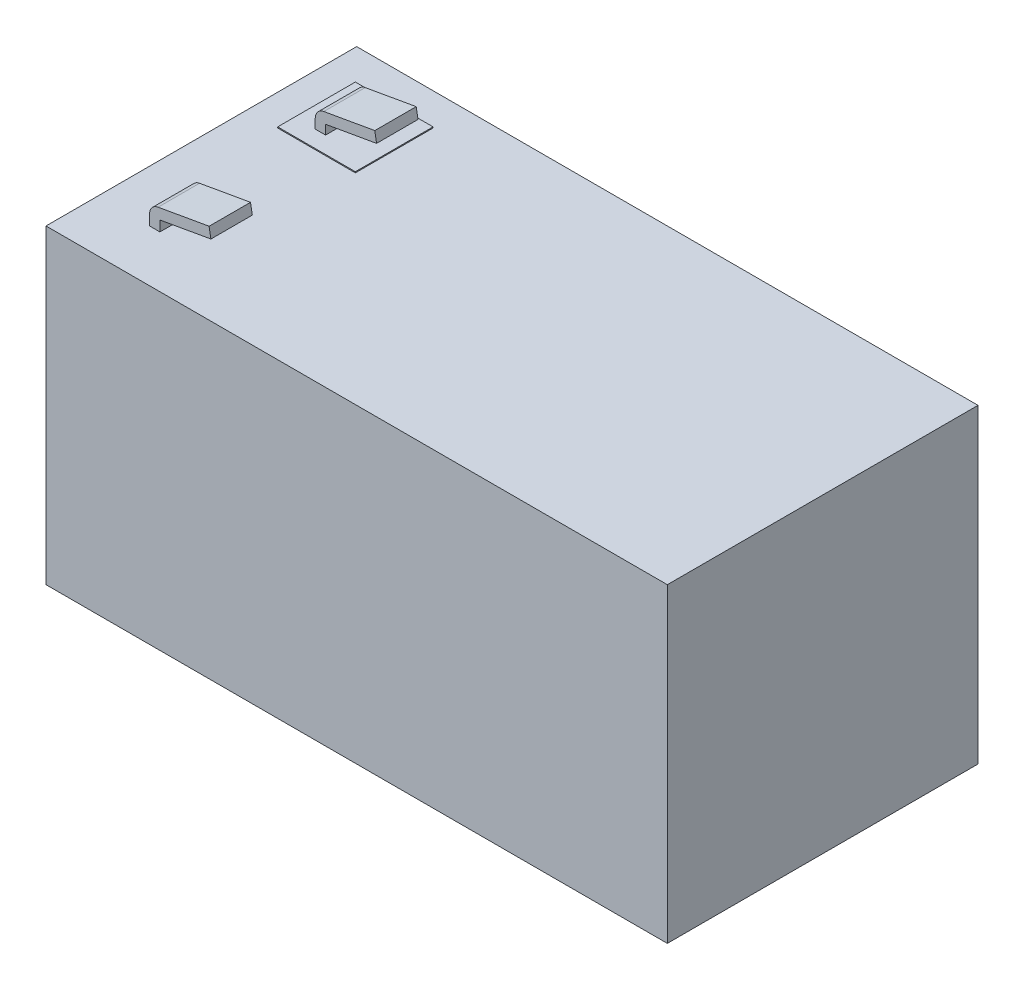
ISO-10303-21;
HEADER;
FILE_DESCRIPTION(('STEP AP214'),'2;1');
FILE_NAME('part.step','',(''),(''),'','','');
FILE_SCHEMA(('AUTOMOTIVE_DESIGN { 1 0 10303 214 1 1 1 1 }'));
ENDSEC;
DATA;
#1=APPLICATION_CONTEXT('core data for automotive mechanical design processes');
#2=APPLICATION_PROTOCOL_DEFINITION('international standard','automotive_design',2000,#1);
#3=PRODUCT_CONTEXT('',#1,'mechanical');
#4=PRODUCT('Part','Part','',(#3));
#5=PRODUCT_RELATED_PRODUCT_CATEGORY('part','',(#4));
#6=PRODUCT_DEFINITION_FORMATION('','',#4);
#7=PRODUCT_DEFINITION_CONTEXT('part definition',#1,'design');
#8=PRODUCT_DEFINITION('design','',#6,#7);
#9=PRODUCT_DEFINITION_SHAPE('','',#8);
#10=(LENGTH_UNIT() NAMED_UNIT(*) SI_UNIT(.MILLI.,.METRE.));
#11=(NAMED_UNIT(*) PLANE_ANGLE_UNIT() SI_UNIT($,.RADIAN.));
#12=(NAMED_UNIT(*) SI_UNIT($,.STERADIAN.) SOLID_ANGLE_UNIT());
#13=UNCERTAINTY_MEASURE_WITH_UNIT(LENGTH_MEASURE(1.E-05),#10,'distance_accuracy_value','');
#14=(GEOMETRIC_REPRESENTATION_CONTEXT(3) GLOBAL_UNCERTAINTY_ASSIGNED_CONTEXT((#13)) GLOBAL_UNIT_ASSIGNED_CONTEXT((#10,
#11,#12)) REPRESENTATION_CONTEXT('',''));
#15=CARTESIAN_POINT('',(0.,0.,0.));
#16=DIRECTION('',(0.,0.,1.));
#17=DIRECTION('',(1.,0.,0.));
#18=AXIS2_PLACEMENT_3D('',#15,#16,#17);
#19=CARTESIAN_POINT('',(-76.2,76.2,38.1));
#20=DIRECTION('',(0.,1.,0.));
#21=DIRECTION('',(0.,0.,1.));
#22=AXIS2_PLACEMENT_3D('',#19,#20,#21);
#23=PLANE('',#22);
#24=DIRECTION('',(0.,0.,1.));
#25=VECTOR('',#24,1.);
#26=CARTESIAN_POINT('',(-76.2,76.2,-38.1));
#27=LINE('',#26,#25);
#28=CARTESIAN_POINT('',(-76.2,76.2,-38.1));
#29=VERTEX_POINT('',#28);
#30=CARTESIAN_POINT('',(-76.2,76.2,38.1));
#31=VERTEX_POINT('',#30);
#32=EDGE_CURVE('E334',#29,#31,#27,.T.);
#33=ORIENTED_EDGE('',*,*,#32,.T.);
#34=DIRECTION('',(1.,0.,0.));
#35=VECTOR('',#34,1.);
#36=CARTESIAN_POINT('',(-76.2,76.2,38.1));
#37=LINE('',#36,#35);
#38=CARTESIAN_POINT('',(76.2,76.2,38.1));
#39=VERTEX_POINT('',#38);
#40=EDGE_CURVE('E337',#31,#39,#37,.T.);
#41=ORIENTED_EDGE('',*,*,#40,.T.);
#42=DIRECTION('',(0.,0.,-1.));
#43=VECTOR('',#42,1.);
#44=CARTESIAN_POINT('',(76.2,76.2,-38.1));
#45=LINE('',#44,#43);
#46=CARTESIAN_POINT('',(76.2,76.2,-38.1));
#47=VERTEX_POINT('',#46);
#48=EDGE_CURVE('E340',#39,#47,#45,.T.);
#49=ORIENTED_EDGE('',*,*,#48,.T.);
#50=DIRECTION('',(-1.,0.,0.));
#51=VECTOR('',#50,1.);
#52=CARTESIAN_POINT('',(-76.2,76.2,-38.1));
#53=LINE('',#52,#51);
#54=EDGE_CURVE('E342',#47,#29,#53,.T.);
#55=ORIENTED_EDGE('',*,*,#54,.T.);
#56=EDGE_LOOP('',(#33,#41,#49,#55));
#57=FACE_BOUND('',#56,.T.);
#58=DIRECTION('',(0.,0.,1.));
#59=VECTOR('',#58,1.);
#60=CARTESIAN_POINT('',(-63.5,76.2,15.24));
#61=LINE('',#60,#59);
#62=CARTESIAN_POINT('',(-63.5,76.2,15.24));
#63=VERTEX_POINT('',#62);
#64=CARTESIAN_POINT('',(-63.5,76.2,25.4));
#65=VERTEX_POINT('',#64);
#66=EDGE_CURVE('E219',#63,#65,#61,.T.);
#67=ORIENTED_EDGE('',*,*,#66,.F.);
#68=DIRECTION('',(-1.,0.,0.));
#69=VECTOR('',#68,1.);
#70=CARTESIAN_POINT('',(-63.5,76.2,15.24));
#71=LINE('',#70,#69);
#72=CARTESIAN_POINT('',(-60.96,76.2,15.24));
#73=VERTEX_POINT('',#72);
#74=EDGE_CURVE('E224',#73,#63,#71,.T.);
#75=ORIENTED_EDGE('',*,*,#74,.F.);
#76=DIRECTION('',(0.,0.,-1.));
#77=VECTOR('',#76,1.);
#78=CARTESIAN_POINT('',(-60.96,76.2,15.24));
#79=LINE('',#78,#77);
#80=CARTESIAN_POINT('',(-60.96,76.2,25.4));
#81=VERTEX_POINT('',#80);
#82=EDGE_CURVE('E233',#81,#73,#79,.T.);
#83=ORIENTED_EDGE('',*,*,#82,.F.);
#84=DIRECTION('',(1.,0.,0.));
#85=VECTOR('',#84,1.);
#86=CARTESIAN_POINT('',(-63.5,76.2,25.4));
#87=LINE('',#86,#85);
#88=EDGE_CURVE('E230',#65,#81,#87,.T.);
#89=ORIENTED_EDGE('',*,*,#88,.F.);
#90=EDGE_LOOP('',(#67,#75,#83,#89));
#91=FACE_BOUND('',#90,.T.);
#92=DIRECTION('',(1.,0.,0.));
#93=VECTOR('',#92,1.);
#94=CARTESIAN_POINT('',(-68.58,76.2,-11.1125));
#95=LINE('',#94,#93);
#96=CARTESIAN_POINT('',(-68.58,76.2,-11.1125));
#97=VERTEX_POINT('',#96);
#98=CARTESIAN_POINT('',(-49.53,76.2,-11.1125));
#99=VERTEX_POINT('',#98);
#100=EDGE_CURVE('E385',#97,#99,#95,.T.);
#101=ORIENTED_EDGE('',*,*,#100,.F.);
#102=DIRECTION('',(0.,0.,1.));
#103=VECTOR('',#102,1.);
#104=CARTESIAN_POINT('',(-68.58,76.2,-30.1625));
#105=LINE('',#104,#103);
#106=CARTESIAN_POINT('',(-68.58,76.2,-30.1625));
#107=VERTEX_POINT('',#106);
#108=EDGE_CURVE('E206',#107,#97,#105,.T.);
#109=ORIENTED_EDGE('',*,*,#108,.F.);
#110=DIRECTION('',(-1.,0.,0.));
#111=VECTOR('',#110,1.);
#112=CARTESIAN_POINT('',(-68.58,76.2,-30.1625));
#113=LINE('',#112,#111);
#114=CARTESIAN_POINT('',(-49.53,76.2,-30.1625));
#115=VERTEX_POINT('',#114);
#116=EDGE_CURVE('E202',#115,#107,#113,.T.);
#117=ORIENTED_EDGE('',*,*,#116,.F.);
#118=DIRECTION('',(0.,0.,-1.));
#119=VECTOR('',#118,1.);
#120=CARTESIAN_POINT('',(-49.53,76.2,-30.1625));
#121=LINE('',#120,#119);
#122=EDGE_CURVE('E387',#99,#115,#121,.T.);
#123=ORIENTED_EDGE('',*,*,#122,.F.);
#124=EDGE_LOOP('',(#101,#109,#117,#123));
#125=FACE_BOUND('',#124,.T.);
#126=ADVANCED_FACE('F35',(#57,#91,#125),#23,.T.);
#127=CARTESIAN_POINT('',(-76.2,76.2,-38.1));
#128=DIRECTION('',(1.,0.,0.));
#129=DIRECTION('',(0.,0.,-1.));
#130=AXIS2_PLACEMENT_3D('',#127,#128,#129);
#131=PLANE('',#130);
#132=DIRECTION('',(0.,0.,1.));
#133=VECTOR('',#132,1.);
#134=CARTESIAN_POINT('',(-76.2,0.,-38.1));
#135=LINE('',#134,#133);
#136=CARTESIAN_POINT('',(-76.2,0.,-38.1));
#137=VERTEX_POINT('',#136);
#138=CARTESIAN_POINT('',(-76.2,0.,38.1));
#139=VERTEX_POINT('',#138);
#140=EDGE_CURVE('E333',#137,#139,#135,.T.);
#141=ORIENTED_EDGE('',*,*,#140,.T.);
#142=DIRECTION('',(0.,-1.,0.));
#143=VECTOR('',#142,1.);
#144=CARTESIAN_POINT('',(-76.2,76.2,38.1));
#145=LINE('',#144,#143);
#146=EDGE_CURVE('E43',#31,#139,#145,.T.);
#147=ORIENTED_EDGE('',*,*,#146,.F.);
#148=ORIENTED_EDGE('',*,*,#32,.F.);
#149=DIRECTION('',(0.,-1.,0.));
#150=VECTOR('',#149,1.);
#151=CARTESIAN_POINT('',(-76.2,76.2,-38.1));
#152=LINE('',#151,#150);
#153=EDGE_CURVE('E344',#29,#137,#152,.T.);
#154=ORIENTED_EDGE('',*,*,#153,.T.);
#155=EDGE_LOOP('',(#141,#147,#148,#154));
#156=FACE_BOUND('',#155,.T.);
#157=ADVANCED_FACE('F37',(#156),#131,.F.);
#158=CARTESIAN_POINT('',(-76.2,76.2,38.1));
#159=DIRECTION('',(0.,0.,-1.));
#160=DIRECTION('',(-1.,0.,0.));
#161=AXIS2_PLACEMENT_3D('',#158,#159,#160);
#162=PLANE('',#161);
#163=DIRECTION('',(1.,0.,0.));
#164=VECTOR('',#163,1.);
#165=CARTESIAN_POINT('',(-76.2,0.,38.1));
#166=LINE('',#165,#164);
#167=CARTESIAN_POINT('',(76.2,0.,38.1));
#168=VERTEX_POINT('',#167);
#169=EDGE_CURVE('E347',#139,#168,#166,.T.);
#170=ORIENTED_EDGE('',*,*,#169,.T.);
#171=DIRECTION('',(0.,-1.,0.));
#172=VECTOR('',#171,1.);
#173=CARTESIAN_POINT('',(76.2,76.2,38.1));
#174=LINE('',#173,#172);
#175=EDGE_CURVE('E357',#39,#168,#174,.T.);
#176=ORIENTED_EDGE('',*,*,#175,.F.);
#177=ORIENTED_EDGE('',*,*,#40,.F.);
#178=ORIENTED_EDGE('',*,*,#146,.T.);
#179=EDGE_LOOP('',(#170,#176,#177,#178));
#180=FACE_BOUND('',#179,.T.);
#181=ADVANCED_FACE('F362',(#180),#162,.F.);
#182=CARTESIAN_POINT('',(76.2,76.2,-38.1));
#183=DIRECTION('',(-1.,0.,0.));
#184=DIRECTION('',(0.,0.,1.));
#185=AXIS2_PLACEMENT_3D('',#182,#183,#184);
#186=PLANE('',#185);
#187=DIRECTION('',(0.,0.,-1.));
#188=VECTOR('',#187,1.);
#189=CARTESIAN_POINT('',(76.2,0.,-38.1));
#190=LINE('',#189,#188);
#191=CARTESIAN_POINT('',(76.2,0.,-38.1));
#192=VERTEX_POINT('',#191);
#193=EDGE_CURVE('E349',#168,#192,#190,.T.);
#194=ORIENTED_EDGE('',*,*,#193,.T.);
#195=DIRECTION('',(0.,-1.,0.));
#196=VECTOR('',#195,1.);
#197=CARTESIAN_POINT('',(76.2,76.2,-38.1));
#198=LINE('',#197,#196);
#199=EDGE_CURVE('E354',#47,#192,#198,.T.);
#200=ORIENTED_EDGE('',*,*,#199,.F.);
#201=ORIENTED_EDGE('',*,*,#48,.F.);
#202=ORIENTED_EDGE('',*,*,#175,.T.);
#203=EDGE_LOOP('',(#194,#200,#201,#202));
#204=FACE_BOUND('',#203,.T.);
#205=ADVANCED_FACE('F374',(#204),#186,.F.);
#206=CARTESIAN_POINT('',(-76.2,76.2,-38.1));
#207=DIRECTION('',(0.,0.,1.));
#208=DIRECTION('',(1.,0.,0.));
#209=AXIS2_PLACEMENT_3D('',#206,#207,#208);
#210=PLANE('',#209);
#211=DIRECTION('',(-1.,0.,0.));
#212=VECTOR('',#211,1.);
#213=CARTESIAN_POINT('',(-76.2,0.,-38.1));
#214=LINE('',#213,#212);
#215=EDGE_CURVE('E338',#192,#137,#214,.T.);
#216=ORIENTED_EDGE('',*,*,#215,.T.);
#217=ORIENTED_EDGE('',*,*,#153,.F.);
#218=ORIENTED_EDGE('',*,*,#54,.F.);
#219=ORIENTED_EDGE('',*,*,#199,.T.);
#220=EDGE_LOOP('',(#216,#217,#218,#219));
#221=FACE_BOUND('',#220,.T.);
#222=ADVANCED_FACE('F378',(#221),#210,.F.);
#223=CARTESIAN_POINT('',(-76.2,0.,38.1));
#224=DIRECTION('',(0.,1.,0.));
#225=DIRECTION('',(0.,0.,1.));
#226=AXIS2_PLACEMENT_3D('',#223,#224,#225);
#227=PLANE('',#226);
#228=ORIENTED_EDGE('',*,*,#140,.F.);
#229=ORIENTED_EDGE('',*,*,#215,.F.);
#230=ORIENTED_EDGE('',*,*,#193,.F.);
#231=ORIENTED_EDGE('',*,*,#169,.F.);
#232=EDGE_LOOP('',(#228,#229,#230,#231));
#233=FACE_BOUND('',#232,.T.);
#234=ADVANCED_FACE('F370',(#233),#227,.F.);
#235=CARTESIAN_POINT('',(-60.96,78.74,15.24));
#236=DIRECTION('',(0.173648177666928,-0.984807753012208,0.));
#237=DIRECTION('',(0.984807753012209,0.173648177666928,0.));
#238=AXIS2_PLACEMENT_3D('',#235,#236,#237);
#239=PLANE('',#238);
#240=DIRECTION('',(0.,0.,-1.));
#241=VECTOR('',#240,1.);
#242=CARTESIAN_POINT('',(-60.96,78.74,15.24));
#243=LINE('',#242,#241);
#244=CARTESIAN_POINT('',(-60.96,78.74,25.4));
#245=VERTEX_POINT('',#244);
#246=CARTESIAN_POINT('',(-60.96,78.74,15.24));
#247=VERTEX_POINT('',#246);
#248=EDGE_CURVE('E223',#245,#247,#243,.T.);
#249=ORIENTED_EDGE('',*,*,#248,.T.);
#250=DIRECTION('',(0.984807753012208,0.173648177666928,0.));
#251=VECTOR('',#250,1.);
#252=CARTESIAN_POINT('',(-60.96,78.74,15.24));
#253=LINE('',#252,#251);
#254=CARTESIAN_POINT('',(-48.452941536745,80.94533185637,15.24));
#255=VERTEX_POINT('',#254);
#256=EDGE_CURVE('E273',#247,#255,#253,.T.);
#257=ORIENTED_EDGE('',*,*,#256,.T.);
#258=DIRECTION('',(0.,0.,-1.));
#259=VECTOR('',#258,1.);
#260=CARTESIAN_POINT('',(-48.452941536745,80.94533185637,15.24));
#261=LINE('',#260,#259);
#262=CARTESIAN_POINT('',(-48.452941536745,80.94533185637,25.4));
#263=VERTEX_POINT('',#262);
#264=EDGE_CURVE('E264',#263,#255,#261,.T.);
#265=ORIENTED_EDGE('',*,*,#264,.F.);
#266=DIRECTION('',(0.984807753012208,0.173648177666928,0.));
#267=VECTOR('',#266,1.);
#268=CARTESIAN_POINT('',(-60.96,78.74,25.4));
#269=LINE('',#268,#267);
#270=EDGE_CURVE('E276',#245,#263,#269,.T.);
#271=ORIENTED_EDGE('',*,*,#270,.F.);
#272=EDGE_LOOP('',(#249,#257,#265,#271));
#273=FACE_BOUND('',#272,.T.);
#274=ADVANCED_FACE('F443',(#273),#239,.T.);
#275=CARTESIAN_POINT('',(-61.401066371274,81.241411692651,15.24));
#276=DIRECTION('',(-0.173648177666928,0.984807753012208,0.));
#277=DIRECTION('',(-0.984807753012209,-0.173648177666928,0.));
#278=AXIS2_PLACEMENT_3D('',#275,#276,#277);
#279=PLANE('',#278);
#280=DIRECTION('',(0.,0.,1.));
#281=VECTOR('',#280,1.);
#282=CARTESIAN_POINT('',(-61.401066371274,81.241411692651,15.24));
#283=LINE('',#282,#281);
#284=CARTESIAN_POINT('',(-61.401066371274,81.241411692651,15.24));
#285=VERTEX_POINT('',#284);
#286=CARTESIAN_POINT('',(-61.401066371274,81.241411692651,25.4));
#287=VERTEX_POINT('',#286);
#288=EDGE_CURVE('E249',#285,#287,#283,.T.);
#289=ORIENTED_EDGE('',*,*,#288,.T.);
#290=DIRECTION('',(0.984807753012208,0.173648177666928,0.));
#291=VECTOR('',#290,1.);
#292=CARTESIAN_POINT('',(-61.401066371274,81.241411692651,25.4));
#293=LINE('',#292,#291);
#294=CARTESIAN_POINT('',(-48.8940079080189,83.446743549021,25.4));
#295=VERTEX_POINT('',#294);
#296=EDGE_CURVE('E279',#287,#295,#293,.T.);
#297=ORIENTED_EDGE('',*,*,#296,.T.);
#298=DIRECTION('',(0.,0.,1.));
#299=VECTOR('',#298,1.);
#300=CARTESIAN_POINT('',(-48.8940079080189,83.446743549021,15.24));
#301=LINE('',#300,#299);
#302=CARTESIAN_POINT('',(-48.8940079080189,83.446743549021,15.24));
#303=VERTEX_POINT('',#302);
#304=EDGE_CURVE('E258',#303,#295,#301,.T.);
#305=ORIENTED_EDGE('',*,*,#304,.F.);
#306=DIRECTION('',(0.984807753012208,0.173648177666928,0.));
#307=VECTOR('',#306,1.);
#308=CARTESIAN_POINT('',(-61.401066371274,81.241411692651,15.24));
#309=LINE('',#308,#307);
#310=EDGE_CURVE('E270',#285,#303,#309,.T.);
#311=ORIENTED_EDGE('',*,*,#310,.F.);
#312=EDGE_LOOP('',(#289,#297,#305,#311));
#313=FACE_BOUND('',#312,.T.);
#314=ADVANCED_FACE('F439',(#313),#279,.T.);
#315=CARTESIAN_POINT('',(-60.96,78.74,0.));
#316=DIRECTION('',(0.,0.,-1.));
#317=DIRECTION('',(-1.,0.,0.));
#318=AXIS2_PLACEMENT_3D('',#315,#316,#317);
#319=CYLINDRICAL_SURFACE('',#318,2.54);
#320=DIRECTION('',(0.,0.,1.));
#321=VECTOR('',#320,1.);
#322=CARTESIAN_POINT('',(-63.5,78.74,15.24));
#323=LINE('',#322,#321);
#324=CARTESIAN_POINT('',(-63.5,78.74,15.24));
#325=VERTEX_POINT('',#324);
#326=CARTESIAN_POINT('',(-63.5,78.74,25.4));
#327=VERTEX_POINT('',#326);
#328=EDGE_CURVE('E220',#325,#327,#323,.T.);
#329=ORIENTED_EDGE('',*,*,#328,.T.);
#330=CARTESIAN_POINT('',(-60.96,78.74,25.4));
#331=DIRECTION('',(0.,0.,-1.));
#332=DIRECTION('',(-1.,0.,0.));
#333=AXIS2_PLACEMENT_3D('',#330,#331,#332);
#334=CIRCLE('',#333,2.54);
#335=EDGE_CURVE('E255',#327,#287,#334,.T.);
#336=ORIENTED_EDGE('',*,*,#335,.T.);
#337=ORIENTED_EDGE('',*,*,#288,.F.);
#338=CARTESIAN_POINT('',(-60.96,78.74,15.24));
#339=DIRECTION('',(0.,0.,-1.));
#340=DIRECTION('',(-1.,0.,0.));
#341=AXIS2_PLACEMENT_3D('',#338,#339,#340);
#342=CIRCLE('',#341,2.54);
#343=EDGE_CURVE('E252',#325,#285,#342,.T.);
#344=ORIENTED_EDGE('',*,*,#343,.F.);
#345=EDGE_LOOP('',(#329,#336,#337,#344));
#346=FACE_BOUND('',#345,.T.);
#347=ADVANCED_FACE('F435',(#346),#319,.T.);
#348=CARTESIAN_POINT('',(-63.5,78.74,15.24));
#349=DIRECTION('',(1.,0.,0.));
#350=DIRECTION('',(0.,0.,-1.));
#351=AXIS2_PLACEMENT_3D('',#348,#349,#350);
#352=PLANE('',#351);
#353=ORIENTED_EDGE('',*,*,#66,.T.);
#354=DIRECTION('',(0.,-1.,0.));
#355=VECTOR('',#354,1.);
#356=CARTESIAN_POINT('',(-63.5,78.74,25.4));
#357=LINE('',#356,#355);
#358=EDGE_CURVE('E246',#327,#65,#357,.T.);
#359=ORIENTED_EDGE('',*,*,#358,.F.);
#360=ORIENTED_EDGE('',*,*,#328,.F.);
#361=DIRECTION('',(0.,-1.,0.));
#362=VECTOR('',#361,1.);
#363=CARTESIAN_POINT('',(-63.5,78.74,15.24));
#364=LINE('',#363,#362);
#365=EDGE_CURVE('E227',#325,#63,#364,.T.);
#366=ORIENTED_EDGE('',*,*,#365,.T.);
#367=EDGE_LOOP('',(#353,#359,#360,#366));
#368=FACE_BOUND('',#367,.T.);
#369=ADVANCED_FACE('F431',(#368),#352,.F.);
#370=CARTESIAN_POINT('',(-63.5,78.74,25.4));
#371=DIRECTION('',(0.,0.,-1.));
#372=DIRECTION('',(-1.,0.,0.));
#373=AXIS2_PLACEMENT_3D('',#370,#371,#372);
#374=PLANE('',#373);
#375=ORIENTED_EDGE('',*,*,#88,.T.);
#376=DIRECTION('',(0.,-1.,0.));
#377=VECTOR('',#376,1.);
#378=CARTESIAN_POINT('',(-60.96,78.74,25.4));
#379=LINE('',#378,#377);
#380=EDGE_CURVE('E243',#245,#81,#379,.T.);
#381=ORIENTED_EDGE('',*,*,#380,.F.);
#382=ORIENTED_EDGE('',*,*,#270,.T.);
#383=DIRECTION('',(0.173648177666925,-0.984807753012209,0.));
#384=VECTOR('',#383,1.);
#385=CARTESIAN_POINT('',(-48.8940079080189,83.446743549021,25.4));
#386=LINE('',#385,#384);
#387=EDGE_CURVE('E267',#295,#263,#386,.T.);
#388=ORIENTED_EDGE('',*,*,#387,.F.);
#389=ORIENTED_EDGE('',*,*,#296,.F.);
#390=ORIENTED_EDGE('',*,*,#335,.F.);
#391=ORIENTED_EDGE('',*,*,#358,.T.);
#392=EDGE_LOOP('',(#375,#381,#382,#388,#389,#390,#391));
#393=FACE_BOUND('',#392,.T.);
#394=ADVANCED_FACE('F427',(#393),#374,.F.);
#395=CARTESIAN_POINT('',(-60.96,78.74,15.24));
#396=DIRECTION('',(-1.,0.,0.));
#397=DIRECTION('',(0.,0.,1.));
#398=AXIS2_PLACEMENT_3D('',#395,#396,#397);
#399=PLANE('',#398);
#400=ORIENTED_EDGE('',*,*,#82,.T.);
#401=DIRECTION('',(0.,-1.,0.));
#402=VECTOR('',#401,1.);
#403=CARTESIAN_POINT('',(-60.96,78.74,15.24));
#404=LINE('',#403,#402);
#405=EDGE_CURVE('E240',#247,#73,#404,.T.);
#406=ORIENTED_EDGE('',*,*,#405,.F.);
#407=ORIENTED_EDGE('',*,*,#248,.F.);
#408=ORIENTED_EDGE('',*,*,#380,.T.);
#409=EDGE_LOOP('',(#400,#406,#407,#408));
#410=FACE_BOUND('',#409,.T.);
#411=ADVANCED_FACE('F423',(#410),#399,.F.);
#412=CARTESIAN_POINT('',(-63.5,78.74,15.24));
#413=DIRECTION('',(0.,0.,1.));
#414=DIRECTION('',(1.,0.,0.));
#415=AXIS2_PLACEMENT_3D('',#412,#413,#414);
#416=PLANE('',#415);
#417=ORIENTED_EDGE('',*,*,#74,.T.);
#418=ORIENTED_EDGE('',*,*,#365,.F.);
#419=ORIENTED_EDGE('',*,*,#343,.T.);
#420=ORIENTED_EDGE('',*,*,#310,.T.);
#421=DIRECTION('',(-0.173648177666925,0.984807753012209,0.));
#422=VECTOR('',#421,1.);
#423=CARTESIAN_POINT('',(-48.8940079080189,83.446743549021,15.24));
#424=LINE('',#423,#422);
#425=EDGE_CURVE('E261',#255,#303,#424,.T.);
#426=ORIENTED_EDGE('',*,*,#425,.F.);
#427=ORIENTED_EDGE('',*,*,#256,.F.);
#428=ORIENTED_EDGE('',*,*,#405,.T.);
#429=EDGE_LOOP('',(#417,#418,#419,#420,#426,#427,#428));
#430=FACE_BOUND('',#429,.T.);
#431=ADVANCED_FACE('F419',(#430),#416,.F.);
#432=CARTESIAN_POINT('',(-48.8940079080189,83.446743549021,25.4));
#433=DIRECTION('',(0.984807753012209,0.173648177666925,0.));
#434=DIRECTION('',(0.,0.,1.));
#435=AXIS2_PLACEMENT_3D('',#432,#433,#434);
#436=PLANE('',#435);
#437=ORIENTED_EDGE('',*,*,#304,.T.);
#438=ORIENTED_EDGE('',*,*,#387,.T.);
#439=ORIENTED_EDGE('',*,*,#264,.T.);
#440=ORIENTED_EDGE('',*,*,#425,.T.);
#441=EDGE_LOOP('',(#437,#438,#439,#440));
#442=FACE_BOUND('',#441,.T.);
#443=ADVANCED_FACE('F416',(#442),#436,.T.);
#444=CARTESIAN_POINT('',(-68.58,76.454,-11.1125));
#445=DIRECTION('',(0.,1.,0.));
#446=DIRECTION('',(0.,0.,1.));
#447=AXIS2_PLACEMENT_3D('',#444,#445,#446);
#448=PLANE('',#447);
#449=DIRECTION('',(0.,0.,1.));
#450=VECTOR('',#449,1.);
#451=CARTESIAN_POINT('',(-68.58,76.454,-30.1625));
#452=LINE('',#451,#450);
#453=CARTESIAN_POINT('',(-68.58,76.454,-30.1625));
#454=VERTEX_POINT('',#453);
#455=CARTESIAN_POINT('',(-68.58,76.454,-11.1125));
#456=VERTEX_POINT('',#455);
#457=EDGE_CURVE('E194',#454,#456,#452,.T.);
#458=ORIENTED_EDGE('',*,*,#457,.T.);
#459=DIRECTION('',(1.,0.,0.));
#460=VECTOR('',#459,1.);
#461=CARTESIAN_POINT('',(-68.58,76.454,-11.1125));
#462=LINE('',#461,#460);
#463=CARTESIAN_POINT('',(-49.53,76.454,-11.1125));
#464=VERTEX_POINT('',#463);
#465=EDGE_CURVE('E183',#456,#464,#462,.T.);
#466=ORIENTED_EDGE('',*,*,#465,.T.);
#467=DIRECTION('',(0.,0.,-1.));
#468=VECTOR('',#467,1.);
#469=CARTESIAN_POINT('',(-49.53,76.454,-30.1625));
#470=LINE('',#469,#468);
#471=CARTESIAN_POINT('',(-49.53,76.454,-30.1625));
#472=VERTEX_POINT('',#471);
#473=EDGE_CURVE('E193',#464,#472,#470,.T.);
#474=ORIENTED_EDGE('',*,*,#473,.T.);
#475=DIRECTION('',(-1.,0.,0.));
#476=VECTOR('',#475,1.);
#477=CARTESIAN_POINT('',(-68.58,76.454,-30.1625));
#478=LINE('',#477,#476);
#479=EDGE_CURVE('E198',#472,#454,#478,.T.);
#480=ORIENTED_EDGE('',*,*,#479,.T.);
#481=EDGE_LOOP('',(#458,#466,#474,#480));
#482=FACE_BOUND('',#481,.T.);
#483=DIRECTION('',(0.,0.,1.));
#484=VECTOR('',#483,1.);
#485=CARTESIAN_POINT('',(-63.5,76.454,-25.4));
#486=LINE('',#485,#484);
#487=CARTESIAN_POINT('',(-63.5,76.454,-25.4));
#488=VERTEX_POINT('',#487);
#489=CARTESIAN_POINT('',(-63.5,76.454,-15.24));
#490=VERTEX_POINT('',#489);
#491=EDGE_CURVE('E58',#488,#490,#486,.T.);
#492=ORIENTED_EDGE('',*,*,#491,.F.);
#493=DIRECTION('',(-1.,0.,0.));
#494=VECTOR('',#493,1.);
#495=CARTESIAN_POINT('',(-63.5,76.454,-25.4));
#496=LINE('',#495,#494);
#497=CARTESIAN_POINT('',(-60.96,76.454,-25.4));
#498=VERTEX_POINT('',#497);
#499=EDGE_CURVE('E11',#498,#488,#496,.T.);
#500=ORIENTED_EDGE('',*,*,#499,.F.);
#501=DIRECTION('',(0.,0.,-1.));
#502=VECTOR('',#501,1.);
#503=CARTESIAN_POINT('',(-60.96,76.454,-25.4));
#504=LINE('',#503,#502);
#505=CARTESIAN_POINT('',(-60.96,76.454,-15.24));
#506=VERTEX_POINT('',#505);
#507=EDGE_CURVE('E208',#506,#498,#504,.T.);
#508=ORIENTED_EDGE('',*,*,#507,.F.);
#509=DIRECTION('',(1.,0.,0.));
#510=VECTOR('',#509,1.);
#511=CARTESIAN_POINT('',(-63.5,76.454,-15.24));
#512=LINE('',#511,#510);
#513=EDGE_CURVE('E211',#490,#506,#512,.T.);
#514=ORIENTED_EDGE('',*,*,#513,.F.);
#515=EDGE_LOOP('',(#492,#500,#508,#514));
#516=FACE_BOUND('',#515,.T.);
#517=ADVANCED_FACE('F197',(#482,#516),#448,.T.);
#518=CARTESIAN_POINT('',(-68.58,76.454,-30.1625));
#519=DIRECTION('',(1.,0.,0.));
#520=DIRECTION('',(0.,0.,-1.));
#521=AXIS2_PLACEMENT_3D('',#518,#519,#520);
#522=PLANE('',#521);
#523=ORIENTED_EDGE('',*,*,#108,.T.);
#524=DIRECTION('',(0.,-1.,0.));
#525=VECTOR('',#524,1.);
#526=CARTESIAN_POINT('',(-68.58,76.454,-11.1125));
#527=LINE('',#526,#525);
#528=EDGE_CURVE('E187',#456,#97,#527,.T.);
#529=ORIENTED_EDGE('',*,*,#528,.F.);
#530=ORIENTED_EDGE('',*,*,#457,.F.);
#531=DIRECTION('',(0.,-1.,0.));
#532=VECTOR('',#531,1.);
#533=CARTESIAN_POINT('',(-68.58,76.454,-30.1625));
#534=LINE('',#533,#532);
#535=EDGE_CURVE('E394',#454,#107,#534,.T.);
#536=ORIENTED_EDGE('',*,*,#535,.T.);
#537=EDGE_LOOP('',(#523,#529,#530,#536));
#538=FACE_BOUND('',#537,.T.);
#539=ADVANCED_FACE('F204',(#538),#522,.F.);
#540=CARTESIAN_POINT('',(-68.58,76.454,-11.1125));
#541=DIRECTION('',(0.,0.,-1.));
#542=DIRECTION('',(-1.,0.,0.));
#543=AXIS2_PLACEMENT_3D('',#540,#541,#542);
#544=PLANE('',#543);
#545=ORIENTED_EDGE('',*,*,#100,.T.);
#546=DIRECTION('',(0.,-1.,0.));
#547=VECTOR('',#546,1.);
#548=CARTESIAN_POINT('',(-49.53,76.454,-11.1125));
#549=LINE('',#548,#547);
#550=EDGE_CURVE('E190',#464,#99,#549,.T.);
#551=ORIENTED_EDGE('',*,*,#550,.F.);
#552=ORIENTED_EDGE('',*,*,#465,.F.);
#553=ORIENTED_EDGE('',*,*,#528,.T.);
#554=EDGE_LOOP('',(#545,#551,#552,#553));
#555=FACE_BOUND('',#554,.T.);
#556=ADVANCED_FACE('F185',(#555),#544,.F.);
#557=CARTESIAN_POINT('',(-49.53,76.454,-30.1625));
#558=DIRECTION('',(-1.,0.,0.));
#559=DIRECTION('',(0.,0.,1.));
#560=AXIS2_PLACEMENT_3D('',#557,#558,#559);
#561=PLANE('',#560);
#562=ORIENTED_EDGE('',*,*,#122,.T.);
#563=DIRECTION('',(0.,-1.,0.));
#564=VECTOR('',#563,1.);
#565=CARTESIAN_POINT('',(-49.53,76.454,-30.1625));
#566=LINE('',#565,#564);
#567=EDGE_CURVE('E50',#472,#115,#566,.T.);
#568=ORIENTED_EDGE('',*,*,#567,.F.);
#569=ORIENTED_EDGE('',*,*,#473,.F.);
#570=ORIENTED_EDGE('',*,*,#550,.T.);
#571=EDGE_LOOP('',(#562,#568,#569,#570));
#572=FACE_BOUND('',#571,.T.);
#573=ADVANCED_FACE('F397',(#572),#561,.F.);
#574=CARTESIAN_POINT('',(-68.58,76.454,-30.1625));
#575=DIRECTION('',(0.,0.,1.));
#576=DIRECTION('',(1.,0.,0.));
#577=AXIS2_PLACEMENT_3D('',#574,#575,#576);
#578=PLANE('',#577);
#579=ORIENTED_EDGE('',*,*,#116,.T.);
#580=ORIENTED_EDGE('',*,*,#535,.F.);
#581=ORIENTED_EDGE('',*,*,#479,.F.);
#582=ORIENTED_EDGE('',*,*,#567,.T.);
#583=EDGE_LOOP('',(#579,#580,#581,#582));
#584=FACE_BOUND('',#583,.T.);
#585=ADVANCED_FACE('F398',(#584),#578,.F.);
#586=CARTESIAN_POINT('',(-60.96,78.74,-25.4));
#587=DIRECTION('',(0.173648177666928,-0.984807753012208,0.));
#588=DIRECTION('',(0.984807753012209,0.173648177666928,0.));
#589=AXIS2_PLACEMENT_3D('',#586,#587,#588);
#590=PLANE('',#589);
#591=DIRECTION('',(0.,0.,-1.));
#592=VECTOR('',#591,1.);
#593=CARTESIAN_POINT('',(-60.96,78.74,-25.4));
#594=LINE('',#593,#592);
#595=CARTESIAN_POINT('',(-60.96,78.74,-15.24));
#596=VERTEX_POINT('',#595);
#597=CARTESIAN_POINT('',(-60.96,78.74,-25.4));
#598=VERTEX_POINT('',#597);
#599=EDGE_CURVE('E285',#596,#598,#594,.T.);
#600=ORIENTED_EDGE('',*,*,#599,.T.);
#601=DIRECTION('',(0.984807753012208,0.173648177666928,0.));
#602=VECTOR('',#601,1.);
#603=CARTESIAN_POINT('',(-60.96,78.74,-25.4));
#604=LINE('',#603,#602);
#605=CARTESIAN_POINT('',(-48.452941536745,80.94533185637,-25.4));
#606=VERTEX_POINT('',#605);
#607=EDGE_CURVE('E324',#598,#606,#604,.T.);
#608=ORIENTED_EDGE('',*,*,#607,.T.);
#609=DIRECTION('',(0.,0.,-1.));
#610=VECTOR('',#609,1.);
#611=CARTESIAN_POINT('',(-48.452941536745,80.94533185637,-25.4));
#612=LINE('',#611,#610);
#613=CARTESIAN_POINT('',(-48.452941536745,80.94533185637,-15.24));
#614=VERTEX_POINT('',#613);
#615=EDGE_CURVE('E315',#614,#606,#612,.T.);
#616=ORIENTED_EDGE('',*,*,#615,.F.);
#617=DIRECTION('',(0.984807753012208,0.173648177666928,0.));
#618=VECTOR('',#617,1.);
#619=CARTESIAN_POINT('',(-60.96,78.74,-15.24));
#620=LINE('',#619,#618);
#621=EDGE_CURVE('E327',#596,#614,#620,.T.);
#622=ORIENTED_EDGE('',*,*,#621,.F.);
#623=EDGE_LOOP('',(#600,#608,#616,#622));
#624=FACE_BOUND('',#623,.T.);
#625=ADVANCED_FACE('F400',(#624),#590,.T.);
#626=CARTESIAN_POINT('',(-48.8940079080189,83.446743549021,-15.24));
#627=DIRECTION('',(0.984807753012209,0.173648177666925,0.));
#628=DIRECTION('',(0.,0.,1.));
#629=AXIS2_PLACEMENT_3D('',#626,#627,#628);
#630=PLANE('',#629);
#631=DIRECTION('',(0.,0.,1.));
#632=VECTOR('',#631,1.);
#633=CARTESIAN_POINT('',(-48.8940079080189,83.446743549021,-25.4));
#634=LINE('',#633,#632);
#635=CARTESIAN_POINT('',(-48.8940079080189,83.446743549021,-25.4));
#636=VERTEX_POINT('',#635);
#637=CARTESIAN_POINT('',(-48.8940079080189,83.446743549021,-15.24));
#638=VERTEX_POINT('',#637);
#639=EDGE_CURVE('E309',#636,#638,#634,.T.);
#640=ORIENTED_EDGE('',*,*,#639,.T.);
#641=DIRECTION('',(0.173648177666925,-0.984807753012209,0.));
#642=VECTOR('',#641,1.);
#643=CARTESIAN_POINT('',(-48.8940079080189,83.446743549021,-15.24));
#644=LINE('',#643,#642);
#645=EDGE_CURVE('E318',#638,#614,#644,.T.);
#646=ORIENTED_EDGE('',*,*,#645,.T.);
#647=ORIENTED_EDGE('',*,*,#615,.T.);
#648=DIRECTION('',(-0.173648177666925,0.984807753012209,0.));
#649=VECTOR('',#648,1.);
#650=CARTESIAN_POINT('',(-48.8940079080189,83.446743549021,-25.4));
#651=LINE('',#650,#649);
#652=EDGE_CURVE('E312',#606,#636,#651,.T.);
#653=ORIENTED_EDGE('',*,*,#652,.T.);
#654=EDGE_LOOP('',(#640,#646,#647,#653));
#655=FACE_BOUND('',#654,.T.);
#656=ADVANCED_FACE('F406',(#655),#630,.T.);
#657=CARTESIAN_POINT('',(-61.401066371274,81.241411692651,-25.4));
#658=DIRECTION('',(-0.173648177666928,0.984807753012208,0.));
#659=DIRECTION('',(-0.984807753012209,-0.173648177666928,0.));
#660=AXIS2_PLACEMENT_3D('',#657,#658,#659);
#661=PLANE('',#660);
#662=DIRECTION('',(0.,0.,1.));
#663=VECTOR('',#662,1.);
#664=CARTESIAN_POINT('',(-61.401066371274,81.241411692651,-25.4));
#665=LINE('',#664,#663);
#666=CARTESIAN_POINT('',(-61.401066371274,81.241411692651,-25.4));
#667=VERTEX_POINT('',#666);
#668=CARTESIAN_POINT('',(-61.401066371274,81.241411692651,-15.24));
#669=VERTEX_POINT('',#668);
#670=EDGE_CURVE('E300',#667,#669,#665,.T.);
#671=ORIENTED_EDGE('',*,*,#670,.T.);
#672=DIRECTION('',(0.984807753012208,0.173648177666928,0.));
#673=VECTOR('',#672,1.);
#674=CARTESIAN_POINT('',(-61.401066371274,81.241411692651,-15.24));
#675=LINE('',#674,#673);
#676=EDGE_CURVE('E330',#669,#638,#675,.T.);
#677=ORIENTED_EDGE('',*,*,#676,.T.);
#678=ORIENTED_EDGE('',*,*,#639,.F.);
#679=DIRECTION('',(0.984807753012208,0.173648177666928,0.));
#680=VECTOR('',#679,1.);
#681=CARTESIAN_POINT('',(-61.401066371274,81.241411692651,-25.4));
#682=LINE('',#681,#680);
#683=EDGE_CURVE('E321',#667,#636,#682,.T.);
#684=ORIENTED_EDGE('',*,*,#683,.F.);
#685=EDGE_LOOP('',(#671,#677,#678,#684));
#686=FACE_BOUND('',#685,.T.);
#687=ADVANCED_FACE('F450',(#686),#661,.T.);
#688=CARTESIAN_POINT('',(-60.96,78.74,0.));
#689=DIRECTION('',(0.,0.,-1.));
#690=DIRECTION('',(-1.,0.,0.));
#691=AXIS2_PLACEMENT_3D('',#688,#689,#690);
#692=CYLINDRICAL_SURFACE('',#691,2.54);
#693=DIRECTION('',(0.,0.,1.));
#694=VECTOR('',#693,1.);
#695=CARTESIAN_POINT('',(-63.5,78.74,-25.4));
#696=LINE('',#695,#694);
#697=CARTESIAN_POINT('',(-63.5,78.74,-25.4));
#698=VERTEX_POINT('',#697);
#699=CARTESIAN_POINT('',(-63.5,78.74,-15.24));
#700=VERTEX_POINT('',#699);
#701=EDGE_CURVE('E282',#698,#700,#696,.T.);
#702=ORIENTED_EDGE('',*,*,#701,.T.);
#703=CARTESIAN_POINT('',(-60.96,78.74,-15.24));
#704=DIRECTION('',(0.,0.,-1.));
#705=DIRECTION('',(-1.,0.,0.));
#706=AXIS2_PLACEMENT_3D('',#703,#704,#705);
#707=CIRCLE('',#706,2.54);
#708=EDGE_CURVE('E306',#700,#669,#707,.T.);
#709=ORIENTED_EDGE('',*,*,#708,.T.);
#710=ORIENTED_EDGE('',*,*,#670,.F.);
#711=CARTESIAN_POINT('',(-60.96,78.74,-25.4));
#712=DIRECTION('',(0.,0.,-1.));
#713=DIRECTION('',(-1.,0.,0.));
#714=AXIS2_PLACEMENT_3D('',#711,#712,#713);
#715=CIRCLE('',#714,2.54);
#716=EDGE_CURVE('E303',#698,#667,#715,.T.);
#717=ORIENTED_EDGE('',*,*,#716,.F.);
#718=EDGE_LOOP('',(#702,#709,#710,#717));
#719=FACE_BOUND('',#718,.T.);
#720=ADVANCED_FACE('F456',(#719),#692,.T.);
#721=CARTESIAN_POINT('',(-63.5,78.74,-25.4));
#722=DIRECTION('',(0.,0.,1.));
#723=DIRECTION('',(1.,0.,0.));
#724=AXIS2_PLACEMENT_3D('',#721,#722,#723);
#725=PLANE('',#724);
#726=DIRECTION('',(0.,-1.,0.));
#727=VECTOR('',#726,1.);
#728=CARTESIAN_POINT('',(-60.96,78.74,-25.4));
#729=LINE('',#728,#727);
#730=EDGE_CURVE('E291',#598,#498,#729,.T.);
#731=ORIENTED_EDGE('',*,*,#730,.T.);
#732=ORIENTED_EDGE('',*,*,#499,.T.);
#733=DIRECTION('',(0.,-1.,0.));
#734=VECTOR('',#733,1.);
#735=CARTESIAN_POINT('',(-63.5,78.74,-25.4));
#736=LINE('',#735,#734);
#737=EDGE_CURVE('E288',#698,#488,#736,.T.);
#738=ORIENTED_EDGE('',*,*,#737,.F.);
#739=ORIENTED_EDGE('',*,*,#716,.T.);
#740=ORIENTED_EDGE('',*,*,#683,.T.);
#741=ORIENTED_EDGE('',*,*,#652,.F.);
#742=ORIENTED_EDGE('',*,*,#607,.F.);
#743=EDGE_LOOP('',(#731,#732,#738,#739,#740,#741,#742));
#744=FACE_BOUND('',#743,.T.);
#745=ADVANCED_FACE('F452',(#744),#725,.F.);
#746=CARTESIAN_POINT('',(-60.96,78.74,-25.4));
#747=DIRECTION('',(-1.,0.,0.));
#748=DIRECTION('',(0.,0.,1.));
#749=AXIS2_PLACEMENT_3D('',#746,#747,#748);
#750=PLANE('',#749);
#751=DIRECTION('',(0.,-1.,0.));
#752=VECTOR('',#751,1.);
#753=CARTESIAN_POINT('',(-60.96,78.74,-15.24));
#754=LINE('',#753,#752);
#755=EDGE_CURVE('E294',#596,#506,#754,.T.);
#756=ORIENTED_EDGE('',*,*,#755,.T.);
#757=ORIENTED_EDGE('',*,*,#507,.T.);
#758=ORIENTED_EDGE('',*,*,#730,.F.);
#759=ORIENTED_EDGE('',*,*,#599,.F.);
#760=EDGE_LOOP('',(#756,#757,#758,#759));
#761=FACE_BOUND('',#760,.T.);
#762=ADVANCED_FACE('F455',(#761),#750,.F.);
#763=CARTESIAN_POINT('',(-63.5,78.74,-15.24));
#764=DIRECTION('',(0.,0.,-1.));
#765=DIRECTION('',(-1.,0.,0.));
#766=AXIS2_PLACEMENT_3D('',#763,#764,#765);
#767=PLANE('',#766);
#768=DIRECTION('',(0.,-1.,0.));
#769=VECTOR('',#768,1.);
#770=CARTESIAN_POINT('',(-63.5,78.74,-15.24));
#771=LINE('',#770,#769);
#772=EDGE_CURVE('E297',#700,#490,#771,.T.);
#773=ORIENTED_EDGE('',*,*,#772,.T.);
#774=ORIENTED_EDGE('',*,*,#513,.T.);
#775=ORIENTED_EDGE('',*,*,#755,.F.);
#776=ORIENTED_EDGE('',*,*,#621,.T.);
#777=ORIENTED_EDGE('',*,*,#645,.F.);
#778=ORIENTED_EDGE('',*,*,#676,.F.);
#779=ORIENTED_EDGE('',*,*,#708,.F.);
#780=EDGE_LOOP('',(#773,#774,#775,#776,#777,#778,#779));
#781=FACE_BOUND('',#780,.T.);
#782=ADVANCED_FACE('F460',(#781),#767,.F.);
#783=CARTESIAN_POINT('',(-63.5,78.74,-25.4));
#784=DIRECTION('',(1.,0.,0.));
#785=DIRECTION('',(0.,0.,-1.));
#786=AXIS2_PLACEMENT_3D('',#783,#784,#785);
#787=PLANE('',#786);
#788=ORIENTED_EDGE('',*,*,#737,.T.);
#789=ORIENTED_EDGE('',*,*,#491,.T.);
#790=ORIENTED_EDGE('',*,*,#772,.F.);
#791=ORIENTED_EDGE('',*,*,#701,.F.);
#792=EDGE_LOOP('',(#788,#789,#790,#791));
#793=FACE_BOUND('',#792,.T.);
#794=ADVANCED_FACE('F464',(#793),#787,.F.);
#795=CLOSED_SHELL('',(#126,#157,#181,#205,#222,#234,#274,#314,#347,#369,#394,#411,#431,#443,
#517,#539,#556,#573,#585,#625,#656,#687,#720,#745,#762,#782,#794));
#796=MANIFOLD_SOLID_BREP('B2',#795);
#797=ADVANCED_BREP_SHAPE_REPRESENTATION('',(#18,#796),#14);
#798=SHAPE_DEFINITION_REPRESENTATION(#9,#797);
ENDSEC;
END-ISO-10303-21;
